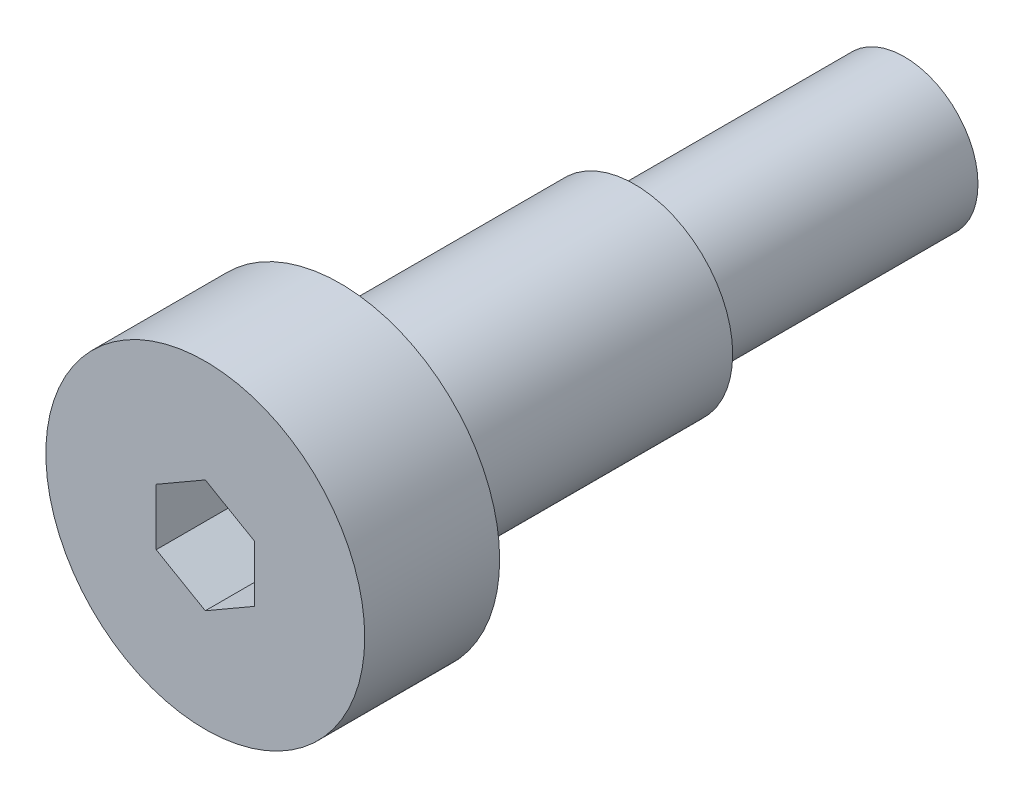
ISO-10303-21;
HEADER;
FILE_DESCRIPTION(('STEP AP214'),'2;1');
FILE_NAME('part.step','',(''),(''),'','','');
FILE_SCHEMA(('AUTOMOTIVE_DESIGN { 1 0 10303 214 1 1 1 1 }'));
ENDSEC;
DATA;
#1=APPLICATION_CONTEXT('core data for automotive mechanical design processes');
#2=APPLICATION_PROTOCOL_DEFINITION('international standard','automotive_design',2000,#1);
#3=PRODUCT_CONTEXT('',#1,'mechanical');
#4=PRODUCT('Part','Part','',(#3));
#5=PRODUCT_RELATED_PRODUCT_CATEGORY('part','',(#4));
#6=PRODUCT_DEFINITION_FORMATION('','',#4);
#7=PRODUCT_DEFINITION_CONTEXT('part definition',#1,'design');
#8=PRODUCT_DEFINITION('design','',#6,#7);
#9=PRODUCT_DEFINITION_SHAPE('','',#8);
#10=(LENGTH_UNIT() NAMED_UNIT(*) SI_UNIT(.MILLI.,.METRE.));
#11=(NAMED_UNIT(*) PLANE_ANGLE_UNIT() SI_UNIT($,.RADIAN.));
#12=(NAMED_UNIT(*) SI_UNIT($,.STERADIAN.) SOLID_ANGLE_UNIT());
#13=UNCERTAINTY_MEASURE_WITH_UNIT(LENGTH_MEASURE(1.E-05),#10,'distance_accuracy_value','');
#14=(GEOMETRIC_REPRESENTATION_CONTEXT(3) GLOBAL_UNCERTAINTY_ASSIGNED_CONTEXT((#13)) GLOBAL_UNIT_ASSIGNED_CONTEXT((#10,
#11,#12)) REPRESENTATION_CONTEXT('',''));
#15=CARTESIAN_POINT('',(0.,0.,0.));
#16=DIRECTION('',(0.,0.,1.));
#17=DIRECTION('',(1.,0.,0.));
#18=AXIS2_PLACEMENT_3D('',#15,#16,#17);
#19=CARTESIAN_POINT('',(0.,0.,19.));
#20=DIRECTION('',(0.,0.,-1.));
#21=DIRECTION('',(-1.,0.,0.));
#22=AXIS2_PLACEMENT_3D('',#19,#20,#21);
#23=CYLINDRICAL_SURFACE('',#22,4.);
#24=CARTESIAN_POINT('',(0.,0.,19.));
#25=DIRECTION('',(0.,0.,1.));
#26=DIRECTION('',(1.,0.,0.));
#27=AXIS2_PLACEMENT_3D('',#24,#25,#26);
#28=CIRCLE('',#27,4.);
#29=CARTESIAN_POINT('',(4.,0.,19.));
#30=VERTEX_POINT('',#29);
#31=EDGE_CURVE('E11',#30,#30,#28,.T.);
#32=ORIENTED_EDGE('',*,*,#31,.F.);
#33=EDGE_LOOP('',(#32));
#34=FACE_BOUND('',#33,.T.);
#35=CARTESIAN_POINT('',(0.,0.,7.));
#36=DIRECTION('',(0.,0.,1.));
#37=DIRECTION('',(1.,0.,0.));
#38=AXIS2_PLACEMENT_3D('',#35,#36,#37);
#39=CIRCLE('',#38,4.);
#40=CARTESIAN_POINT('',(4.,0.,7.));
#41=VERTEX_POINT('',#40);
#42=EDGE_CURVE('E46',#41,#41,#39,.T.);
#43=ORIENTED_EDGE('',*,*,#42,.T.);
#44=EDGE_LOOP('',(#43));
#45=FACE_BOUND('',#44,.T.);
#46=ADVANCED_FACE('F43',(#34,#45),#23,.T.);
#47=CARTESIAN_POINT('',(0.,0.,7.));
#48=DIRECTION('',(0.,0.,1.));
#49=DIRECTION('',(1.,0.,0.));
#50=AXIS2_PLACEMENT_3D('',#47,#48,#49);
#51=PLANE('',#50);
#52=CARTESIAN_POINT('',(0.,0.,7.));
#53=DIRECTION('',(0.,0.,1.));
#54=DIRECTION('',(1.,0.,0.));
#55=AXIS2_PLACEMENT_3D('',#52,#53,#54);
#56=CIRCLE('',#55,3.);
#57=CARTESIAN_POINT('',(3.,0.,7.));
#58=VERTEX_POINT('',#57);
#59=EDGE_CURVE('E152',#58,#58,#56,.T.);
#60=ORIENTED_EDGE('',*,*,#59,.T.);
#61=EDGE_LOOP('',(#60));
#62=FACE_BOUND('',#61,.T.);
#63=ORIENTED_EDGE('',*,*,#42,.F.);
#64=EDGE_LOOP('',(#63));
#65=FACE_BOUND('',#64,.T.);
#66=ADVANCED_FACE('F170',(#62,#65),#51,.F.);
#67=CARTESIAN_POINT('',(0.,0.,7.));
#68=DIRECTION('',(0.,0.,-1.));
#69=DIRECTION('',(-1.,0.,0.));
#70=AXIS2_PLACEMENT_3D('',#67,#68,#69);
#71=CYLINDRICAL_SURFACE('',#70,3.);
#72=ORIENTED_EDGE('',*,*,#59,.F.);
#73=EDGE_LOOP('',(#72));
#74=FACE_BOUND('',#73,.T.);
#75=CARTESIAN_POINT('',(0.,0.,-4.));
#76=DIRECTION('',(0.,0.,1.));
#77=DIRECTION('',(1.,0.,0.));
#78=AXIS2_PLACEMENT_3D('',#75,#76,#77);
#79=CIRCLE('',#78,3.);
#80=CARTESIAN_POINT('',(3.,0.,-4.));
#81=VERTEX_POINT('',#80);
#82=EDGE_CURVE('E149',#81,#81,#79,.T.);
#83=ORIENTED_EDGE('',*,*,#82,.T.);
#84=EDGE_LOOP('',(#83));
#85=FACE_BOUND('',#84,.T.);
#86=ADVANCED_FACE('F158',(#74,#85),#71,.T.);
#87=CARTESIAN_POINT('',(0.,0.,-4.));
#88=DIRECTION('',(0.,0.,1.));
#89=DIRECTION('',(1.,0.,0.));
#90=AXIS2_PLACEMENT_3D('',#87,#88,#89);
#91=PLANE('',#90);
#92=ORIENTED_EDGE('',*,*,#82,.F.);
#93=EDGE_LOOP('',(#92));
#94=FACE_BOUND('',#93,.T.);
#95=ADVANCED_FACE('F160',(#94),#91,.F.);
#96=CARTESIAN_POINT('',(0.,0.,24.5));
#97=DIRECTION('',(0.,0.,1.));
#98=DIRECTION('',(1.,0.,0.));
#99=AXIS2_PLACEMENT_3D('',#96,#97,#98);
#100=PLANE('',#99);
#101=CARTESIAN_POINT('',(0.,0.,24.5));
#102=DIRECTION('',(0.,0.,1.));
#103=DIRECTION('',(1.,0.,0.));
#104=AXIS2_PLACEMENT_3D('',#101,#102,#103);
#105=CIRCLE('',#104,6.5);
#106=CARTESIAN_POINT('',(6.5,0.,24.5));
#107=VERTEX_POINT('',#106);
#108=EDGE_CURVE('E146',#107,#107,#105,.T.);
#109=ORIENTED_EDGE('',*,*,#108,.T.);
#110=EDGE_LOOP('',(#109));
#111=FACE_BOUND('',#110,.T.);
#112=DIRECTION('',(-0.866025403784439,0.5,0.));
#113=VECTOR('',#112,1.);
#114=CARTESIAN_POINT('',(2.,1.15470053837925,24.5));
#115=LINE('',#114,#113);
#116=CARTESIAN_POINT('',(2.,1.15470053837925,24.5));
#117=VERTEX_POINT('',#116);
#118=CARTESIAN_POINT('',(0.,2.3094010767585,24.5));
#119=VERTEX_POINT('',#118);
#120=EDGE_CURVE('E103',#117,#119,#115,.T.);
#121=ORIENTED_EDGE('',*,*,#120,.F.);
#122=DIRECTION('',(0.,1.,0.));
#123=VECTOR('',#122,1.);
#124=CARTESIAN_POINT('',(2.,-1.15470053837925,24.5));
#125=LINE('',#124,#123);
#126=CARTESIAN_POINT('',(2.,-1.15470053837925,24.5));
#127=VERTEX_POINT('',#126);
#128=EDGE_CURVE('E94',#127,#117,#125,.T.);
#129=ORIENTED_EDGE('',*,*,#128,.F.);
#130=DIRECTION('',(0.866025403784439,0.5,0.));
#131=VECTOR('',#130,1.);
#132=CARTESIAN_POINT('',(0.,-2.3094010767585,24.5));
#133=LINE('',#132,#131);
#134=CARTESIAN_POINT('',(0.,-2.3094010767585,24.5));
#135=VERTEX_POINT('',#134);
#136=EDGE_CURVE('E124',#135,#127,#133,.T.);
#137=ORIENTED_EDGE('',*,*,#136,.F.);
#138=DIRECTION('',(0.866025403784438,-0.5,0.));
#139=VECTOR('',#138,1.);
#140=CARTESIAN_POINT('',(-2.,-1.15470053837925,24.5));
#141=LINE('',#140,#139);
#142=CARTESIAN_POINT('',(-2.,-1.15470053837925,24.5));
#143=VERTEX_POINT('',#142);
#144=EDGE_CURVE('E121',#143,#135,#141,.T.);
#145=ORIENTED_EDGE('',*,*,#144,.F.);
#146=DIRECTION('',(0.,-1.,0.));
#147=VECTOR('',#146,1.);
#148=CARTESIAN_POINT('',(-2.,1.15470053837925,24.5));
#149=LINE('',#148,#147);
#150=CARTESIAN_POINT('',(-2.,1.15470053837925,24.5));
#151=VERTEX_POINT('',#150);
#152=EDGE_CURVE('E117',#151,#143,#149,.T.);
#153=ORIENTED_EDGE('',*,*,#152,.F.);
#154=DIRECTION('',(-0.866025403784439,-0.5,0.));
#155=VECTOR('',#154,1.);
#156=CARTESIAN_POINT('',(0.,2.3094010767585,24.5));
#157=LINE('',#156,#155);
#158=EDGE_CURVE('E115',#119,#151,#157,.T.);
#159=ORIENTED_EDGE('',*,*,#158,.F.);
#160=EDGE_LOOP('',(#121,#129,#137,#145,#153,#159));
#161=FACE_BOUND('',#160,.T.);
#162=ADVANCED_FACE('F113',(#111,#161),#100,.T.);
#163=CARTESIAN_POINT('',(0.,0.,19.));
#164=DIRECTION('',(0.,0.,1.));
#165=DIRECTION('',(1.,0.,0.));
#166=AXIS2_PLACEMENT_3D('',#163,#164,#165);
#167=PLANE('',#166);
#168=ORIENTED_EDGE('',*,*,#31,.T.);
#169=EDGE_LOOP('',(#168));
#170=FACE_BOUND('',#169,.T.);
#171=CARTESIAN_POINT('',(0.,0.,19.));
#172=DIRECTION('',(0.,0.,1.));
#173=DIRECTION('',(1.,0.,0.));
#174=AXIS2_PLACEMENT_3D('',#171,#172,#173);
#175=CIRCLE('',#174,6.5);
#176=CARTESIAN_POINT('',(6.5,0.,19.));
#177=VERTEX_POINT('',#176);
#178=EDGE_CURVE('E109',#177,#177,#175,.T.);
#179=ORIENTED_EDGE('',*,*,#178,.F.);
#180=EDGE_LOOP('',(#179));
#181=FACE_BOUND('',#180,.T.);
#182=ADVANCED_FACE('F167',(#170,#181),#167,.F.);
#183=CARTESIAN_POINT('',(0.,0.,24.5));
#184=DIRECTION('',(0.,0.,-1.));
#185=DIRECTION('',(-1.,0.,0.));
#186=AXIS2_PLACEMENT_3D('',#183,#184,#185);
#187=CYLINDRICAL_SURFACE('',#186,6.5);
#188=ORIENTED_EDGE('',*,*,#108,.F.);
#189=EDGE_LOOP('',(#188));
#190=FACE_BOUND('',#189,.T.);
#191=ORIENTED_EDGE('',*,*,#178,.T.);
#192=EDGE_LOOP('',(#191));
#193=FACE_BOUND('',#192,.T.);
#194=ADVANCED_FACE('F188',(#190,#193),#187,.T.);
#195=CARTESIAN_POINT('',(2.,-1.15470053837925,24.5));
#196=DIRECTION('',(-1.,0.,0.));
#197=DIRECTION('',(0.,-1.,0.));
#198=AXIS2_PLACEMENT_3D('',#195,#196,#197);
#199=PLANE('',#198);
#200=DIRECTION('',(0.,1.,0.));
#201=VECTOR('',#200,1.);
#202=CARTESIAN_POINT('',(2.,-1.15470053837925,19.));
#203=LINE('',#202,#201);
#204=CARTESIAN_POINT('',(2.,-1.15470053837925,19.));
#205=VERTEX_POINT('',#204);
#206=CARTESIAN_POINT('',(2.,1.15470053837925,19.));
#207=VERTEX_POINT('',#206);
#208=EDGE_CURVE('E57',#205,#207,#203,.T.);
#209=ORIENTED_EDGE('',*,*,#208,.F.);
#210=DIRECTION('',(0.,0.,-1.));
#211=VECTOR('',#210,1.);
#212=CARTESIAN_POINT('',(2.,-1.15470053837925,24.5));
#213=LINE('',#212,#211);
#214=EDGE_CURVE('E99',#127,#205,#213,.T.);
#215=ORIENTED_EDGE('',*,*,#214,.F.);
#216=ORIENTED_EDGE('',*,*,#128,.T.);
#217=DIRECTION('',(0.,0.,-1.));
#218=VECTOR('',#217,1.);
#219=CARTESIAN_POINT('',(2.,1.15470053837925,24.5));
#220=LINE('',#219,#218);
#221=EDGE_CURVE('E97',#117,#207,#220,.T.);
#222=ORIENTED_EDGE('',*,*,#221,.T.);
#223=EDGE_LOOP('',(#209,#215,#216,#222));
#224=FACE_BOUND('',#223,.T.);
#225=ADVANCED_FACE('F96',(#224),#199,.T.);
#226=CARTESIAN_POINT('',(2.,1.15470053837925,24.5));
#227=DIRECTION('',(-0.5,-0.866025403784439,0.));
#228=DIRECTION('',(0.866025403784439,-0.5,0.));
#229=AXIS2_PLACEMENT_3D('',#226,#227,#228);
#230=PLANE('',#229);
#231=DIRECTION('',(-0.866025403784439,0.5,0.));
#232=VECTOR('',#231,1.);
#233=CARTESIAN_POINT('',(2.,1.15470053837925,19.));
#234=LINE('',#233,#232);
#235=CARTESIAN_POINT('',(0.,2.3094010767585,19.));
#236=VERTEX_POINT('',#235);
#237=EDGE_CURVE('E61',#207,#236,#234,.T.);
#238=ORIENTED_EDGE('',*,*,#237,.F.);
#239=ORIENTED_EDGE('',*,*,#221,.F.);
#240=ORIENTED_EDGE('',*,*,#120,.T.);
#241=DIRECTION('',(0.,0.,-1.));
#242=VECTOR('',#241,1.);
#243=CARTESIAN_POINT('',(0.,2.3094010767585,24.5));
#244=LINE('',#243,#242);
#245=EDGE_CURVE('E110',#119,#236,#244,.T.);
#246=ORIENTED_EDGE('',*,*,#245,.T.);
#247=EDGE_LOOP('',(#238,#239,#240,#246));
#248=FACE_BOUND('',#247,.T.);
#249=ADVANCED_FACE('F107',(#248),#230,.T.);
#250=CARTESIAN_POINT('',(0.,2.3094010767585,24.5));
#251=DIRECTION('',(0.5,-0.866025403784439,0.));
#252=DIRECTION('',(0.866025403784439,0.5,0.));
#253=AXIS2_PLACEMENT_3D('',#250,#251,#252);
#254=PLANE('',#253);
#255=DIRECTION('',(-0.866025403784439,-0.5,0.));
#256=VECTOR('',#255,1.);
#257=CARTESIAN_POINT('',(0.,2.3094010767585,19.));
#258=LINE('',#257,#256);
#259=CARTESIAN_POINT('',(-2.,1.15470053837925,19.));
#260=VERTEX_POINT('',#259);
#261=EDGE_CURVE('E128',#236,#260,#258,.T.);
#262=ORIENTED_EDGE('',*,*,#261,.F.);
#263=ORIENTED_EDGE('',*,*,#245,.F.);
#264=ORIENTED_EDGE('',*,*,#158,.T.);
#265=DIRECTION('',(0.,0.,-1.));
#266=VECTOR('',#265,1.);
#267=CARTESIAN_POINT('',(-2.,1.15470053837925,24.5));
#268=LINE('',#267,#266);
#269=EDGE_CURVE('E142',#151,#260,#268,.T.);
#270=ORIENTED_EDGE('',*,*,#269,.T.);
#271=EDGE_LOOP('',(#262,#263,#264,#270));
#272=FACE_BOUND('',#271,.T.);
#273=ADVANCED_FACE('F202',(#272),#254,.T.);
#274=CARTESIAN_POINT('',(-2.,1.15470053837925,24.5));
#275=DIRECTION('',(1.,0.,0.));
#276=DIRECTION('',(0.,1.,0.));
#277=AXIS2_PLACEMENT_3D('',#274,#275,#276);
#278=PLANE('',#277);
#279=DIRECTION('',(0.,-1.,0.));
#280=VECTOR('',#279,1.);
#281=CARTESIAN_POINT('',(-2.,1.15470053837925,19.));
#282=LINE('',#281,#280);
#283=CARTESIAN_POINT('',(-2.,-1.15470053837925,19.));
#284=VERTEX_POINT('',#283);
#285=EDGE_CURVE('E130',#260,#284,#282,.T.);
#286=ORIENTED_EDGE('',*,*,#285,.F.);
#287=ORIENTED_EDGE('',*,*,#269,.F.);
#288=ORIENTED_EDGE('',*,*,#152,.T.);
#289=DIRECTION('',(0.,0.,-1.));
#290=VECTOR('',#289,1.);
#291=CARTESIAN_POINT('',(-2.,-1.15470053837925,24.5));
#292=LINE('',#291,#290);
#293=EDGE_CURVE('E139',#143,#284,#292,.T.);
#294=ORIENTED_EDGE('',*,*,#293,.T.);
#295=EDGE_LOOP('',(#286,#287,#288,#294));
#296=FACE_BOUND('',#295,.T.);
#297=ADVANCED_FACE('F205',(#296),#278,.T.);
#298=CARTESIAN_POINT('',(-2.,-1.15470053837925,24.5));
#299=DIRECTION('',(0.5,0.866025403784439,0.));
#300=DIRECTION('',(-0.866025403784439,0.5,0.));
#301=AXIS2_PLACEMENT_3D('',#298,#299,#300);
#302=PLANE('',#301);
#303=DIRECTION('',(0.866025403784438,-0.5,0.));
#304=VECTOR('',#303,1.);
#305=CARTESIAN_POINT('',(-2.,-1.15470053837925,19.));
#306=LINE('',#305,#304);
#307=CARTESIAN_POINT('',(0.,-2.3094010767585,19.));
#308=VERTEX_POINT('',#307);
#309=EDGE_CURVE('E132',#284,#308,#306,.T.);
#310=ORIENTED_EDGE('',*,*,#309,.F.);
#311=ORIENTED_EDGE('',*,*,#293,.F.);
#312=ORIENTED_EDGE('',*,*,#144,.T.);
#313=DIRECTION('',(0.,0.,-1.));
#314=VECTOR('',#313,1.);
#315=CARTESIAN_POINT('',(0.,-2.3094010767585,24.5));
#316=LINE('',#315,#314);
#317=EDGE_CURVE('E136',#135,#308,#316,.T.);
#318=ORIENTED_EDGE('',*,*,#317,.T.);
#319=EDGE_LOOP('',(#310,#311,#312,#318));
#320=FACE_BOUND('',#319,.T.);
#321=ADVANCED_FACE('F209',(#320),#302,.T.);
#322=CARTESIAN_POINT('',(0.,-2.3094010767585,24.5));
#323=DIRECTION('',(-0.5,0.866025403784439,0.));
#324=DIRECTION('',(-0.866025403784439,-0.5,0.));
#325=AXIS2_PLACEMENT_3D('',#322,#323,#324);
#326=PLANE('',#325);
#327=DIRECTION('',(0.866025403784439,0.5,0.));
#328=VECTOR('',#327,1.);
#329=CARTESIAN_POINT('',(0.,-2.3094010767585,19.));
#330=LINE('',#329,#328);
#331=EDGE_CURVE('E104',#308,#205,#330,.T.);
#332=ORIENTED_EDGE('',*,*,#331,.F.);
#333=ORIENTED_EDGE('',*,*,#317,.F.);
#334=ORIENTED_EDGE('',*,*,#136,.T.);
#335=ORIENTED_EDGE('',*,*,#214,.T.);
#336=EDGE_LOOP('',(#332,#333,#334,#335));
#337=FACE_BOUND('',#336,.T.);
#338=ADVANCED_FACE('F213',(#337),#326,.T.);
#339=CARTESIAN_POINT('',(0.,0.,19.));
#340=DIRECTION('',(0.,0.,1.));
#341=DIRECTION('',(1.,0.,0.));
#342=AXIS2_PLACEMENT_3D('',#339,#340,#341);
#343=PLANE('',#342);
#344=ORIENTED_EDGE('',*,*,#208,.T.);
#345=ORIENTED_EDGE('',*,*,#237,.T.);
#346=ORIENTED_EDGE('',*,*,#261,.T.);
#347=ORIENTED_EDGE('',*,*,#285,.T.);
#348=ORIENTED_EDGE('',*,*,#309,.T.);
#349=ORIENTED_EDGE('',*,*,#331,.T.);
#350=EDGE_LOOP('',(#344,#345,#346,#347,#348,#349));
#351=FACE_BOUND('',#350,.T.);
#352=ADVANCED_FACE('F216',(#351),#343,.T.);
#353=CLOSED_SHELL('',(#46,#66,#86,#95,#162,#182,#194,#225,#249,#273,#297,#321,#338,#352));
#354=MANIFOLD_SOLID_BREP('B2',#353);
#355=ADVANCED_BREP_SHAPE_REPRESENTATION('',(#18,#354),#14);
#356=SHAPE_DEFINITION_REPRESENTATION(#9,#355);
ENDSEC;
END-ISO-10303-21;
